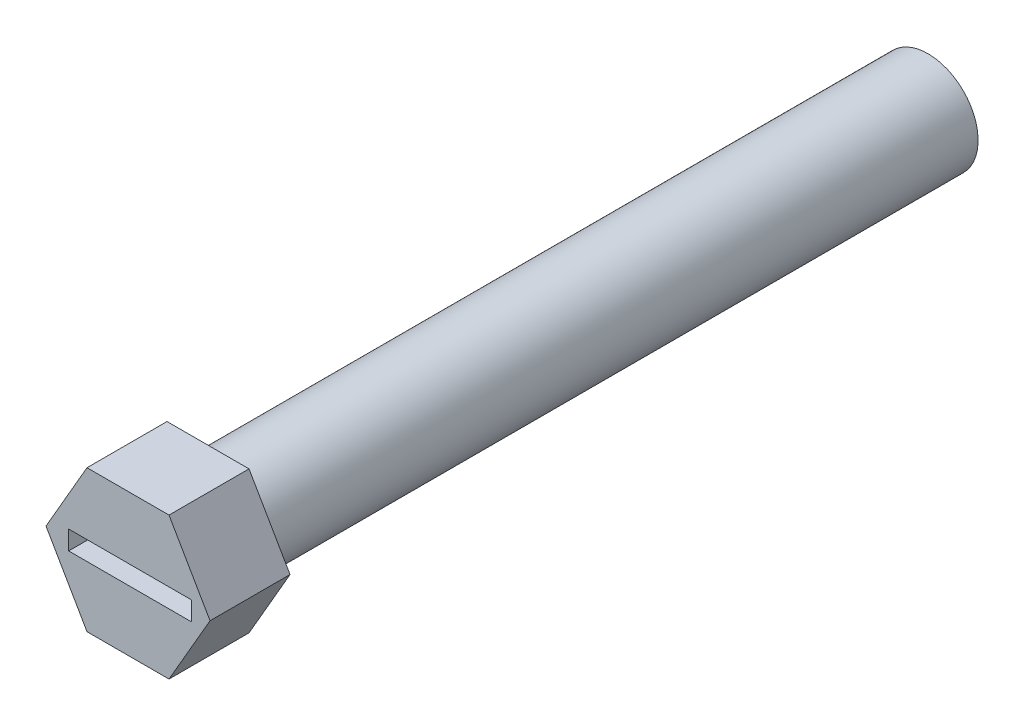
ISO-10303-21;
HEADER;
FILE_DESCRIPTION(('STEP AP214'),'2;1');
FILE_NAME('part.step','',(''),(''),'','','');
FILE_SCHEMA(('AUTOMOTIVE_DESIGN { 1 0 10303 214 1 1 1 1 }'));
ENDSEC;
DATA;
#1=APPLICATION_CONTEXT('core data for automotive mechanical design processes');
#2=APPLICATION_PROTOCOL_DEFINITION('international standard','automotive_design',2000,#1);
#3=PRODUCT_CONTEXT('',#1,'mechanical');
#4=PRODUCT('Part','Part','',(#3));
#5=PRODUCT_RELATED_PRODUCT_CATEGORY('part','',(#4));
#6=PRODUCT_DEFINITION_FORMATION('','',#4);
#7=PRODUCT_DEFINITION_CONTEXT('part definition',#1,'design');
#8=PRODUCT_DEFINITION('design','',#6,#7);
#9=PRODUCT_DEFINITION_SHAPE('','',#8);
#10=(LENGTH_UNIT() NAMED_UNIT(*) SI_UNIT(.MILLI.,.METRE.));
#11=(NAMED_UNIT(*) PLANE_ANGLE_UNIT() SI_UNIT($,.RADIAN.));
#12=(NAMED_UNIT(*) SI_UNIT($,.STERADIAN.) SOLID_ANGLE_UNIT());
#13=UNCERTAINTY_MEASURE_WITH_UNIT(LENGTH_MEASURE(1.E-05),#10,'distance_accuracy_value','');
#14=(GEOMETRIC_REPRESENTATION_CONTEXT(3) GLOBAL_UNCERTAINTY_ASSIGNED_CONTEXT((#13)) GLOBAL_UNIT_ASSIGNED_CONTEXT((#10,
#11,#12)) REPRESENTATION_CONTEXT('',''));
#15=CARTESIAN_POINT('',(0.,0.,0.));
#16=DIRECTION('',(0.,0.,1.));
#17=DIRECTION('',(1.,0.,0.));
#18=AXIS2_PLACEMENT_3D('',#15,#16,#17);
#19=CARTESIAN_POINT('',(0.,0.,180.));
#20=DIRECTION('',(0.,0.,-1.));
#21=DIRECTION('',(-1.,0.,0.));
#22=AXIS2_PLACEMENT_3D('',#19,#20,#21);
#23=CYLINDRICAL_SURFACE('',#22,12.5);
#24=CARTESIAN_POINT('',(0.,0.,180.));
#25=DIRECTION('',(0.,0.,1.));
#26=DIRECTION('',(1.,0.,0.));
#27=AXIS2_PLACEMENT_3D('',#24,#25,#26);
#28=CIRCLE('',#27,12.5);
#29=CARTESIAN_POINT('',(-12.5,0.,180.));
#30=VERTEX_POINT('',#29);
#31=EDGE_CURVE('E11',#30,#30,#28,.T.);
#32=CARTESIAN_POINT('',(0.,0.,0.));
#33=DIRECTION('',(0.,0.,1.));
#34=DIRECTION('',(1.,0.,0.));
#35=AXIS2_PLACEMENT_3D('',#32,#33,#34);
#36=CIRCLE('',#35,12.5);
#37=CARTESIAN_POINT('',(-12.5,0.,0.));
#38=VERTEX_POINT('',#37);
#39=EDGE_CURVE('E35',#38,#38,#36,.T.);
#40=CARTESIAN_POINT('',(-12.5,0.,180.));
#41=CARTESIAN_POINT('',(-12.5,0.,178.125));
#42=CARTESIAN_POINT('',(-12.5,0.,176.25));
#43=CARTESIAN_POINT('',(-12.5,0.,172.5));
#44=CARTESIAN_POINT('',(-12.5,0.,170.625));
#45=CARTESIAN_POINT('',(-12.5,0.,166.875));
#46=CARTESIAN_POINT('',(-12.5,0.,165.));
#47=CARTESIAN_POINT('',(-12.5,0.,161.25));
#48=CARTESIAN_POINT('',(-12.5,0.,159.375));
#49=CARTESIAN_POINT('',(-12.5,0.,155.625));
#50=CARTESIAN_POINT('',(-12.5,0.,153.75));
#51=CARTESIAN_POINT('',(-12.5,0.,150.));
#52=CARTESIAN_POINT('',(-12.5,0.,148.125));
#53=CARTESIAN_POINT('',(-12.5,0.,144.375));
#54=CARTESIAN_POINT('',(-12.5,0.,142.5));
#55=CARTESIAN_POINT('',(-12.5,0.,138.75));
#56=CARTESIAN_POINT('',(-12.5,0.,136.875));
#57=CARTESIAN_POINT('',(-12.5,0.,133.125));
#58=CARTESIAN_POINT('',(-12.5,0.,131.25));
#59=CARTESIAN_POINT('',(-12.5,0.,127.5));
#60=CARTESIAN_POINT('',(-12.5,0.,125.625));
#61=CARTESIAN_POINT('',(-12.5,0.,121.875));
#62=CARTESIAN_POINT('',(-12.5,0.,120.));
#63=CARTESIAN_POINT('',(-12.5,0.,116.25));
#64=CARTESIAN_POINT('',(-12.5,0.,114.375));
#65=CARTESIAN_POINT('',(-12.5,0.,110.625));
#66=CARTESIAN_POINT('',(-12.5,0.,108.75));
#67=CARTESIAN_POINT('',(-12.5,0.,105.));
#68=CARTESIAN_POINT('',(-12.5,0.,103.125));
#69=CARTESIAN_POINT('',(-12.5,0.,99.375));
#70=CARTESIAN_POINT('',(-12.5,0.,97.5));
#71=CARTESIAN_POINT('',(-12.5,0.,93.75));
#72=CARTESIAN_POINT('',(-12.5,0.,91.875));
#73=CARTESIAN_POINT('',(-12.5,0.,88.125));
#74=CARTESIAN_POINT('',(-12.5,0.,86.25));
#75=CARTESIAN_POINT('',(-12.5,0.,82.5));
#76=CARTESIAN_POINT('',(-12.5,0.,80.625));
#77=CARTESIAN_POINT('',(-12.5,0.,76.875));
#78=CARTESIAN_POINT('',(-12.5,0.,75.));
#79=CARTESIAN_POINT('',(-12.5,0.,71.25));
#80=CARTESIAN_POINT('',(-12.5,0.,69.375));
#81=CARTESIAN_POINT('',(-12.5,0.,65.625));
#82=CARTESIAN_POINT('',(-12.5,0.,63.75));
#83=CARTESIAN_POINT('',(-12.5,0.,60.));
#84=CARTESIAN_POINT('',(-12.5,0.,58.125));
#85=CARTESIAN_POINT('',(-12.5,0.,54.375));
#86=CARTESIAN_POINT('',(-12.5,0.,52.5));
#87=CARTESIAN_POINT('',(-12.5,0.,48.75));
#88=CARTESIAN_POINT('',(-12.5,0.,46.875));
#89=CARTESIAN_POINT('',(-12.5,0.,43.125));
#90=CARTESIAN_POINT('',(-12.5,0.,41.25));
#91=CARTESIAN_POINT('',(-12.5,0.,37.5));
#92=CARTESIAN_POINT('',(-12.5,0.,35.625));
#93=CARTESIAN_POINT('',(-12.5,0.,31.875));
#94=CARTESIAN_POINT('',(-12.5,0.,30.));
#95=CARTESIAN_POINT('',(-12.5,0.,26.25));
#96=CARTESIAN_POINT('',(-12.5,0.,24.375));
#97=CARTESIAN_POINT('',(-12.5,0.,20.625));
#98=CARTESIAN_POINT('',(-12.5,0.,18.75));
#99=CARTESIAN_POINT('',(-12.5,0.,15.));
#100=CARTESIAN_POINT('',(-12.5,0.,13.125));
#101=CARTESIAN_POINT('',(-12.5,0.,9.37499999999998));
#102=CARTESIAN_POINT('',(-12.5,0.,7.49999999999997));
#103=CARTESIAN_POINT('',(-12.5,0.,3.74999999999997));
#104=CARTESIAN_POINT('',(-12.5,0.,1.87499999999997));
#105=CARTESIAN_POINT('',(-12.5,0.,0.));
#106=B_SPLINE_CURVE_WITH_KNOTS('',3,(#40,#41,#42,#43,#44,#45,#46,#47,#48,#49,#50,#51,#52,#53,
#54,#55,#56,#57,#58,#59,#60,#61,#62,#63,#64,#65,#66,#67,#68,#69,#70,#71,#72,#73,#74,#75,#76,#77,
#78,#79,#80,#81,#82,#83,#84,#85,#86,#87,#88,#89,#90,#91,#92,#93,#94,#95,#96,#97,#98,#99,#100,
#101,#102,#103,#104,#105),.UNSPECIFIED.,.F.,.F.,(4,2,2,2,2,2,2,2,2,2,2,2,2,2,2,2,2,2,2,2,2,2,2,
2,2,2,2,2,2,2,2,2,4),(0.,5.62499999999999,11.25,16.875,22.5,28.125,33.75,39.375,45.,50.625,
56.25,61.875,67.5,73.125,78.75,84.375,90.,95.625,101.25,106.875,112.5,118.125,123.75,129.375,
135.,140.625,146.25,151.875,157.5,163.125,168.75,174.375,180.),.UNSPECIFIED.);
#107=EDGE_CURVE('BSEAM32',#30,#38,#106,.T.);
#108=ORIENTED_EDGE('',*,*,#31,.F.);
#109=ORIENTED_EDGE('',*,*,#39,.T.);
#110=ORIENTED_EDGE('',*,*,#107,.T.);
#111=ORIENTED_EDGE('',*,*,#107,.F.);
#112=EDGE_LOOP('',(#108,#110,#109,#111));
#113=FACE_BOUND('',#112,.T.);
#114=ADVANCED_FACE('F32',(#113),#23,.T.);
#115=CARTESIAN_POINT('',(0.,0.,0.));
#116=DIRECTION('',(0.,0.,1.));
#117=DIRECTION('',(1.,0.,0.));
#118=AXIS2_PLACEMENT_3D('',#115,#116,#117);
#119=PLANE('',#118);
#120=ORIENTED_EDGE('',*,*,#39,.F.);
#121=EDGE_LOOP('',(#120));
#122=FACE_BOUND('',#121,.T.);
#123=ADVANCED_FACE('F154',(#122),#119,.F.);
#124=CARTESIAN_POINT('',(0.,0.,180.));
#125=DIRECTION('',(0.,0.,1.));
#126=DIRECTION('',(1.,0.,0.));
#127=AXIS2_PLACEMENT_3D('',#124,#125,#126);
#128=PLANE('',#127);
#129=DIRECTION('',(0.499999999999995,0.866025403784441,0.));
#130=VECTOR('',#129,1.);
#131=CARTESIAN_POINT('',(10.2505991358113,-17.7545585112464,180.));
#132=LINE('',#131,#130);
#133=CARTESIAN_POINT('',(10.2505991358113,-17.7545585112464,180.));
#134=VERTEX_POINT('',#133);
#135=CARTESIAN_POINT('',(20.5011982716222,0.,180.));
#136=VERTEX_POINT('',#135);
#137=EDGE_CURVE('E129',#134,#136,#132,.T.);
#138=ORIENTED_EDGE('',*,*,#137,.F.);
#139=DIRECTION('',(1.,0.,0.));
#140=VECTOR('',#139,1.);
#141=CARTESIAN_POINT('',(-10.250599135811,-17.7545585112466,180.));
#142=LINE('',#141,#140);
#143=CARTESIAN_POINT('',(-10.250599135811,-17.7545585112466,180.));
#144=VERTEX_POINT('',#143);
#145=EDGE_CURVE('E82',#144,#134,#142,.T.);
#146=ORIENTED_EDGE('',*,*,#145,.F.);
#147=DIRECTION('',(0.500000000000007,-0.866025403784435,0.));
#148=VECTOR('',#147,1.);
#149=CARTESIAN_POINT('',(-20.5011982716222,-1.43159102378584E-13,180.));
#150=LINE('',#149,#148);
#151=CARTESIAN_POINT('',(-20.5011982716222,-1.43159102378584E-13,180.));
#152=VERTEX_POINT('',#151);
#153=EDGE_CURVE('E138',#152,#144,#150,.T.);
#154=ORIENTED_EDGE('',*,*,#153,.F.);
#155=DIRECTION('',(-0.499999999999995,-0.866025403784442,0.));
#156=VECTOR('',#155,1.);
#157=CARTESIAN_POINT('',(-10.2505991358112,17.7545585112464,180.));
#158=LINE('',#157,#156);
#159=CARTESIAN_POINT('',(-10.2505991358112,17.7545585112464,180.));
#160=VERTEX_POINT('',#159);
#161=EDGE_CURVE('E117',#160,#152,#158,.T.);
#162=ORIENTED_EDGE('',*,*,#161,.F.);
#163=DIRECTION('',(-1.,0.,0.));
#164=VECTOR('',#163,1.);
#165=CARTESIAN_POINT('',(10.2505991358111,17.7545585112465,180.));
#166=LINE('',#165,#164);
#167=CARTESIAN_POINT('',(10.2505991358111,17.7545585112465,180.));
#168=VERTEX_POINT('',#167);
#169=EDGE_CURVE('E135',#168,#160,#166,.T.);
#170=ORIENTED_EDGE('',*,*,#169,.F.);
#171=DIRECTION('',(-0.500000000000001,0.866025403784438,0.));
#172=VECTOR('',#171,1.);
#173=CARTESIAN_POINT('',(20.5011982716222,0.,180.));
#174=LINE('',#173,#172);
#175=EDGE_CURVE('E132',#136,#168,#174,.T.);
#176=ORIENTED_EDGE('',*,*,#175,.F.);
#177=EDGE_LOOP('',(#138,#146,#154,#162,#170,#176));
#178=FACE_BOUND('',#177,.T.);
#179=ORIENTED_EDGE('',*,*,#31,.T.);
#180=EDGE_LOOP('',(#179));
#181=FACE_BOUND('',#180,.T.);
#182=ADVANCED_FACE('F156',(#178,#181),#128,.F.);
#183=CARTESIAN_POINT('',(10.2505991358113,-17.7545585112464,200.));
#184=DIRECTION('',(-0.866025403784442,0.499999999999995,0.));
#185=DIRECTION('',(-0.499999999999995,-0.866025403784442,0.));
#186=AXIS2_PLACEMENT_3D('',#183,#184,#185);
#187=PLANE('',#186);
#188=ORIENTED_EDGE('',*,*,#137,.T.);
#189=DIRECTION('',(0.,0.,-1.));
#190=VECTOR('',#189,1.);
#191=CARTESIAN_POINT('',(20.5011982716222,0.,200.));
#192=LINE('',#191,#190);
#193=CARTESIAN_POINT('',(20.5011982716222,0.,200.));
#194=VERTEX_POINT('',#193);
#195=EDGE_CURVE('E148',#194,#136,#192,.T.);
#196=ORIENTED_EDGE('',*,*,#195,.F.);
#197=DIRECTION('',(0.499999999999995,0.866025403784441,0.));
#198=VECTOR('',#197,1.);
#199=CARTESIAN_POINT('',(10.2505991358113,-17.7545585112464,200.));
#200=LINE('',#199,#198);
#201=CARTESIAN_POINT('',(10.2505991358113,-17.7545585112464,200.));
#202=VERTEX_POINT('',#201);
#203=EDGE_CURVE('E141',#202,#194,#200,.T.);
#204=ORIENTED_EDGE('',*,*,#203,.F.);
#205=DIRECTION('',(0.,0.,-1.));
#206=VECTOR('',#205,1.);
#207=CARTESIAN_POINT('',(10.2505991358113,-17.7545585112464,200.));
#208=LINE('',#207,#206);
#209=EDGE_CURVE('E125',#202,#134,#208,.T.);
#210=ORIENTED_EDGE('',*,*,#209,.T.);
#211=EDGE_LOOP('',(#188,#196,#204,#210));
#212=FACE_BOUND('',#211,.T.);
#213=ADVANCED_FACE('F161',(#212),#187,.F.);
#214=CARTESIAN_POINT('',(20.5011982716222,0.,200.));
#215=DIRECTION('',(-0.866025403784438,-0.500000000000001,0.));
#216=DIRECTION('',(0.500000000000001,-0.866025403784438,0.));
#217=AXIS2_PLACEMENT_3D('',#214,#215,#216);
#218=PLANE('',#217);
#219=ORIENTED_EDGE('',*,*,#175,.T.);
#220=DIRECTION('',(0.,0.,-1.));
#221=VECTOR('',#220,1.);
#222=CARTESIAN_POINT('',(10.2505991358111,17.7545585112465,200.));
#223=LINE('',#222,#221);
#224=CARTESIAN_POINT('',(10.2505991358111,17.7545585112465,200.));
#225=VERTEX_POINT('',#224);
#226=EDGE_CURVE('E145',#225,#168,#223,.T.);
#227=ORIENTED_EDGE('',*,*,#226,.F.);
#228=DIRECTION('',(-0.500000000000001,0.866025403784438,0.));
#229=VECTOR('',#228,1.);
#230=CARTESIAN_POINT('',(20.5011982716222,0.,200.));
#231=LINE('',#230,#229);
#232=EDGE_CURVE('E91',#194,#225,#231,.T.);
#233=ORIENTED_EDGE('',*,*,#232,.F.);
#234=ORIENTED_EDGE('',*,*,#195,.T.);
#235=EDGE_LOOP('',(#219,#227,#233,#234));
#236=FACE_BOUND('',#235,.T.);
#237=ADVANCED_FACE('F168',(#236),#218,.F.);
#238=CARTESIAN_POINT('',(10.2505991358111,17.7545585112465,200.));
#239=DIRECTION('',(0.,-1.,0.));
#240=DIRECTION('',(1.,0.,0.));
#241=AXIS2_PLACEMENT_3D('',#238,#239,#240);
#242=PLANE('',#241);
#243=ORIENTED_EDGE('',*,*,#169,.T.);
#244=DIRECTION('',(0.,0.,-1.));
#245=VECTOR('',#244,1.);
#246=CARTESIAN_POINT('',(-10.2505991358112,17.7545585112464,200.));
#247=LINE('',#246,#245);
#248=CARTESIAN_POINT('',(-10.2505991358112,17.7545585112464,200.));
#249=VERTEX_POINT('',#248);
#250=EDGE_CURVE('E120',#249,#160,#247,.T.);
#251=ORIENTED_EDGE('',*,*,#250,.F.);
#252=DIRECTION('',(-1.,0.,0.));
#253=VECTOR('',#252,1.);
#254=CARTESIAN_POINT('',(10.2505991358111,17.7545585112465,200.));
#255=LINE('',#254,#253);
#256=EDGE_CURVE('E108',#225,#249,#255,.T.);
#257=ORIENTED_EDGE('',*,*,#256,.F.);
#258=ORIENTED_EDGE('',*,*,#226,.T.);
#259=EDGE_LOOP('',(#243,#251,#257,#258));
#260=FACE_BOUND('',#259,.T.);
#261=ADVANCED_FACE('F172',(#260),#242,.F.);
#262=CARTESIAN_POINT('',(-10.2505991358112,17.7545585112464,200.));
#263=DIRECTION('',(0.866025403784442,-0.499999999999995,0.));
#264=DIRECTION('',(0.499999999999995,0.866025403784442,0.));
#265=AXIS2_PLACEMENT_3D('',#262,#263,#264);
#266=PLANE('',#265);
#267=ORIENTED_EDGE('',*,*,#161,.T.);
#268=DIRECTION('',(0.,0.,-1.));
#269=VECTOR('',#268,1.);
#270=CARTESIAN_POINT('',(-20.5011982716222,-1.43159102378584E-13,200.));
#271=LINE('',#270,#269);
#272=CARTESIAN_POINT('',(-20.5011982716222,-1.43159102378584E-13,200.));
#273=VERTEX_POINT('',#272);
#274=EDGE_CURVE('E114',#273,#152,#271,.T.);
#275=ORIENTED_EDGE('',*,*,#274,.F.);
#276=DIRECTION('',(-0.499999999999995,-0.866025403784442,0.));
#277=VECTOR('',#276,1.);
#278=CARTESIAN_POINT('',(-10.2505991358112,17.7545585112464,200.));
#279=LINE('',#278,#277);
#280=EDGE_CURVE('E101',#249,#273,#279,.T.);
#281=ORIENTED_EDGE('',*,*,#280,.F.);
#282=ORIENTED_EDGE('',*,*,#250,.T.);
#283=EDGE_LOOP('',(#267,#275,#281,#282));
#284=FACE_BOUND('',#283,.T.);
#285=ADVANCED_FACE('F115',(#284),#266,.F.);
#286=CARTESIAN_POINT('',(-20.5011982716222,-1.43159102378584E-13,200.));
#287=DIRECTION('',(0.866025403784434,0.500000000000007,0.));
#288=DIRECTION('',(-0.500000000000007,0.866025403784435,0.));
#289=AXIS2_PLACEMENT_3D('',#286,#287,#288);
#290=PLANE('',#289);
#291=ORIENTED_EDGE('',*,*,#153,.T.);
#292=DIRECTION('',(0.,0.,-1.));
#293=VECTOR('',#292,1.);
#294=CARTESIAN_POINT('',(-10.250599135811,-17.7545585112466,200.));
#295=LINE('',#294,#293);
#296=CARTESIAN_POINT('',(-10.250599135811,-17.7545585112466,200.));
#297=VERTEX_POINT('',#296);
#298=EDGE_CURVE('E121',#297,#144,#295,.T.);
#299=ORIENTED_EDGE('',*,*,#298,.F.);
#300=DIRECTION('',(0.500000000000007,-0.866025403784435,0.));
#301=VECTOR('',#300,1.);
#302=CARTESIAN_POINT('',(-20.5011982716222,-1.43159102378584E-13,200.));
#303=LINE('',#302,#301);
#304=EDGE_CURVE('E105',#273,#297,#303,.T.);
#305=ORIENTED_EDGE('',*,*,#304,.F.);
#306=ORIENTED_EDGE('',*,*,#274,.T.);
#307=EDGE_LOOP('',(#291,#299,#305,#306));
#308=FACE_BOUND('',#307,.T.);
#309=ADVANCED_FACE('F123',(#308),#290,.F.);
#310=CARTESIAN_POINT('',(-10.250599135811,-17.7545585112466,200.));
#311=DIRECTION('',(0.,1.,0.));
#312=DIRECTION('',(-1.,0.,0.));
#313=AXIS2_PLACEMENT_3D('',#310,#311,#312);
#314=PLANE('',#313);
#315=ORIENTED_EDGE('',*,*,#145,.T.);
#316=ORIENTED_EDGE('',*,*,#209,.F.);
#317=DIRECTION('',(1.,0.,0.));
#318=VECTOR('',#317,1.);
#319=CARTESIAN_POINT('',(-10.250599135811,-17.7545585112466,200.));
#320=LINE('',#319,#318);
#321=EDGE_CURVE('E55',#297,#202,#320,.T.);
#322=ORIENTED_EDGE('',*,*,#321,.F.);
#323=ORIENTED_EDGE('',*,*,#298,.T.);
#324=EDGE_LOOP('',(#315,#316,#322,#323));
#325=FACE_BOUND('',#324,.T.);
#326=ADVANCED_FACE('F180',(#325),#314,.F.);
#327=CARTESIAN_POINT('',(0.,0.,200.));
#328=DIRECTION('',(0.,0.,1.));
#329=DIRECTION('',(1.,0.,0.));
#330=AXIS2_PLACEMENT_3D('',#327,#328,#329);
#331=PLANE('',#330);
#332=DIRECTION('',(0.,-1.,0.));
#333=VECTOR('',#332,1.);
#334=CARTESIAN_POINT('',(-14.8334794054209,2.19621903818192,200.));
#335=LINE('',#334,#333);
#336=CARTESIAN_POINT('',(-14.8334794054209,2.19621903818192,200.));
#337=VERTEX_POINT('',#336);
#338=CARTESIAN_POINT('',(-14.8334794054209,-2.55625494607916,200.));
#339=VERTEX_POINT('',#338);
#340=EDGE_CURVE('E46',#337,#339,#335,.T.);
#341=ORIENTED_EDGE('',*,*,#340,.F.);
#342=DIRECTION('',(-1.,0.,0.));
#343=VECTOR('',#342,1.);
#344=CARTESIAN_POINT('',(-14.8334794054209,2.19621903818192,200.));
#345=LINE('',#344,#343);
#346=CARTESIAN_POINT('',(15.8415799475369,2.19621903818192,200.));
#347=VERTEX_POINT('',#346);
#348=EDGE_CURVE('E219',#347,#337,#345,.T.);
#349=ORIENTED_EDGE('',*,*,#348,.F.);
#350=DIRECTION('',(0.,1.,0.));
#351=VECTOR('',#350,1.);
#352=CARTESIAN_POINT('',(15.8415799475369,2.19621903818192,200.));
#353=LINE('',#352,#351);
#354=CARTESIAN_POINT('',(15.8415799475369,-2.55625494607916,200.));
#355=VERTEX_POINT('',#354);
#356=EDGE_CURVE('E224',#355,#347,#353,.T.);
#357=ORIENTED_EDGE('',*,*,#356,.F.);
#358=DIRECTION('',(1.,0.,0.));
#359=VECTOR('',#358,1.);
#360=CARTESIAN_POINT('',(-14.8334794054209,-2.55625494607916,200.));
#361=LINE('',#360,#359);
#362=EDGE_CURVE('E231',#339,#355,#361,.T.);
#363=ORIENTED_EDGE('',*,*,#362,.F.);
#364=EDGE_LOOP('',(#341,#349,#357,#363));
#365=FACE_BOUND('',#364,.T.);
#366=ORIENTED_EDGE('',*,*,#203,.T.);
#367=ORIENTED_EDGE('',*,*,#232,.T.);
#368=ORIENTED_EDGE('',*,*,#256,.T.);
#369=ORIENTED_EDGE('',*,*,#280,.T.);
#370=ORIENTED_EDGE('',*,*,#304,.T.);
#371=ORIENTED_EDGE('',*,*,#321,.T.);
#372=EDGE_LOOP('',(#366,#367,#368,#369,#370,#371));
#373=FACE_BOUND('',#372,.T.);
#374=ADVANCED_FACE('F103',(#365,#373),#331,.T.);
#375=CARTESIAN_POINT('',(-14.8334794054209,2.19621903818192,185.));
#376=DIRECTION('',(-1.,0.,0.));
#377=DIRECTION('',(0.,0.,1.));
#378=AXIS2_PLACEMENT_3D('',#375,#376,#377);
#379=PLANE('',#378);
#380=ORIENTED_EDGE('',*,*,#340,.T.);
#381=DIRECTION('',(0.,0.,1.));
#382=VECTOR('',#381,1.);
#383=CARTESIAN_POINT('',(-14.8334794054209,-2.55625494607916,185.));
#384=LINE('',#383,#382);
#385=CARTESIAN_POINT('',(-14.8334794054209,-2.55625494607916,185.));
#386=VERTEX_POINT('',#385);
#387=EDGE_CURVE('E229',#386,#339,#384,.T.);
#388=ORIENTED_EDGE('',*,*,#387,.F.);
#389=DIRECTION('',(0.,-1.,0.));
#390=VECTOR('',#389,1.);
#391=CARTESIAN_POINT('',(-14.8334794054209,2.19621903818192,185.));
#392=LINE('',#391,#390);
#393=CARTESIAN_POINT('',(-14.8334794054209,2.19621903818192,185.));
#394=VERTEX_POINT('',#393);
#395=EDGE_CURVE('E211',#394,#386,#392,.T.);
#396=ORIENTED_EDGE('',*,*,#395,.F.);
#397=DIRECTION('',(0.,0.,1.));
#398=VECTOR('',#397,1.);
#399=CARTESIAN_POINT('',(-14.8334794054209,2.19621903818192,185.));
#400=LINE('',#399,#398);
#401=EDGE_CURVE('E133',#394,#337,#400,.T.);
#402=ORIENTED_EDGE('',*,*,#401,.T.);
#403=EDGE_LOOP('',(#380,#388,#396,#402));
#404=FACE_BOUND('',#403,.T.);
#405=ADVANCED_FACE('F185',(#404),#379,.F.);
#406=CARTESIAN_POINT('',(-14.8334794054209,2.19621903818192,185.));
#407=DIRECTION('',(0.,1.,0.));
#408=DIRECTION('',(0.,0.,1.));
#409=AXIS2_PLACEMENT_3D('',#406,#407,#408);
#410=PLANE('',#409);
#411=ORIENTED_EDGE('',*,*,#348,.T.);
#412=ORIENTED_EDGE('',*,*,#401,.F.);
#413=DIRECTION('',(-1.,0.,0.));
#414=VECTOR('',#413,1.);
#415=CARTESIAN_POINT('',(-14.8334794054209,2.19621903818192,185.));
#416=LINE('',#415,#414);
#417=CARTESIAN_POINT('',(15.8415799475369,2.19621903818192,185.));
#418=VERTEX_POINT('',#417);
#419=EDGE_CURVE('E217',#418,#394,#416,.T.);
#420=ORIENTED_EDGE('',*,*,#419,.F.);
#421=DIRECTION('',(0.,0.,1.));
#422=VECTOR('',#421,1.);
#423=CARTESIAN_POINT('',(15.8415799475369,2.19621903818192,185.));
#424=LINE('',#423,#422);
#425=EDGE_CURVE('E237',#418,#347,#424,.T.);
#426=ORIENTED_EDGE('',*,*,#425,.T.);
#427=EDGE_LOOP('',(#411,#412,#420,#426));
#428=FACE_BOUND('',#427,.T.);
#429=ADVANCED_FACE('F189',(#428),#410,.F.);
#430=CARTESIAN_POINT('',(15.8415799475369,2.19621903818192,185.));
#431=DIRECTION('',(1.,0.,0.));
#432=DIRECTION('',(0.,0.,-1.));
#433=AXIS2_PLACEMENT_3D('',#430,#431,#432);
#434=PLANE('',#433);
#435=ORIENTED_EDGE('',*,*,#356,.T.);
#436=ORIENTED_EDGE('',*,*,#425,.F.);
#437=DIRECTION('',(0.,1.,0.));
#438=VECTOR('',#437,1.);
#439=CARTESIAN_POINT('',(15.8415799475369,2.19621903818192,185.));
#440=LINE('',#439,#438);
#441=CARTESIAN_POINT('',(15.8415799475369,-2.55625494607916,185.));
#442=VERTEX_POINT('',#441);
#443=EDGE_CURVE('E221',#442,#418,#440,.T.);
#444=ORIENTED_EDGE('',*,*,#443,.F.);
#445=DIRECTION('',(0.,0.,1.));
#446=VECTOR('',#445,1.);
#447=CARTESIAN_POINT('',(15.8415799475369,-2.55625494607916,185.));
#448=LINE('',#447,#446);
#449=EDGE_CURVE('E240',#442,#355,#448,.T.);
#450=ORIENTED_EDGE('',*,*,#449,.T.);
#451=EDGE_LOOP('',(#435,#436,#444,#450));
#452=FACE_BOUND('',#451,.T.);
#453=ADVANCED_FACE('F194',(#452),#434,.F.);
#454=CARTESIAN_POINT('',(-14.8334794054209,-2.55625494607916,185.));
#455=DIRECTION('',(0.,-1.,0.));
#456=DIRECTION('',(0.,0.,-1.));
#457=AXIS2_PLACEMENT_3D('',#454,#455,#456);
#458=PLANE('',#457);
#459=ORIENTED_EDGE('',*,*,#362,.T.);
#460=ORIENTED_EDGE('',*,*,#449,.F.);
#461=DIRECTION('',(1.,0.,0.));
#462=VECTOR('',#461,1.);
#463=CARTESIAN_POINT('',(-14.8334794054209,-2.55625494607916,185.));
#464=LINE('',#463,#462);
#465=EDGE_CURVE('E215',#386,#442,#464,.T.);
#466=ORIENTED_EDGE('',*,*,#465,.F.);
#467=ORIENTED_EDGE('',*,*,#387,.T.);
#468=EDGE_LOOP('',(#459,#460,#466,#467));
#469=FACE_BOUND('',#468,.T.);
#470=ADVANCED_FACE('F190',(#469),#458,.F.);
#471=CARTESIAN_POINT('',(0.,0.,185.));
#472=DIRECTION('',(0.,0.,1.));
#473=DIRECTION('',(1.,0.,0.));
#474=AXIS2_PLACEMENT_3D('',#471,#472,#473);
#475=PLANE('',#474);
#476=ORIENTED_EDGE('',*,*,#395,.T.);
#477=ORIENTED_EDGE('',*,*,#465,.T.);
#478=ORIENTED_EDGE('',*,*,#443,.T.);
#479=ORIENTED_EDGE('',*,*,#419,.T.);
#480=EDGE_LOOP('',(#476,#477,#478,#479));
#481=FACE_BOUND('',#480,.T.);
#482=ADVANCED_FACE('F193',(#481),#475,.T.);
#483=CLOSED_SHELL('',(#114,#123,#182,#213,#237,#261,#285,#309,#326,#374,#405,#429,#453,#470,#482));
#484=MANIFOLD_SOLID_BREP('B2',#483);
#485=ADVANCED_BREP_SHAPE_REPRESENTATION('',(#18,#484),#14);
#486=SHAPE_DEFINITION_REPRESENTATION(#9,#485);
ENDSEC;
END-ISO-10303-21;
